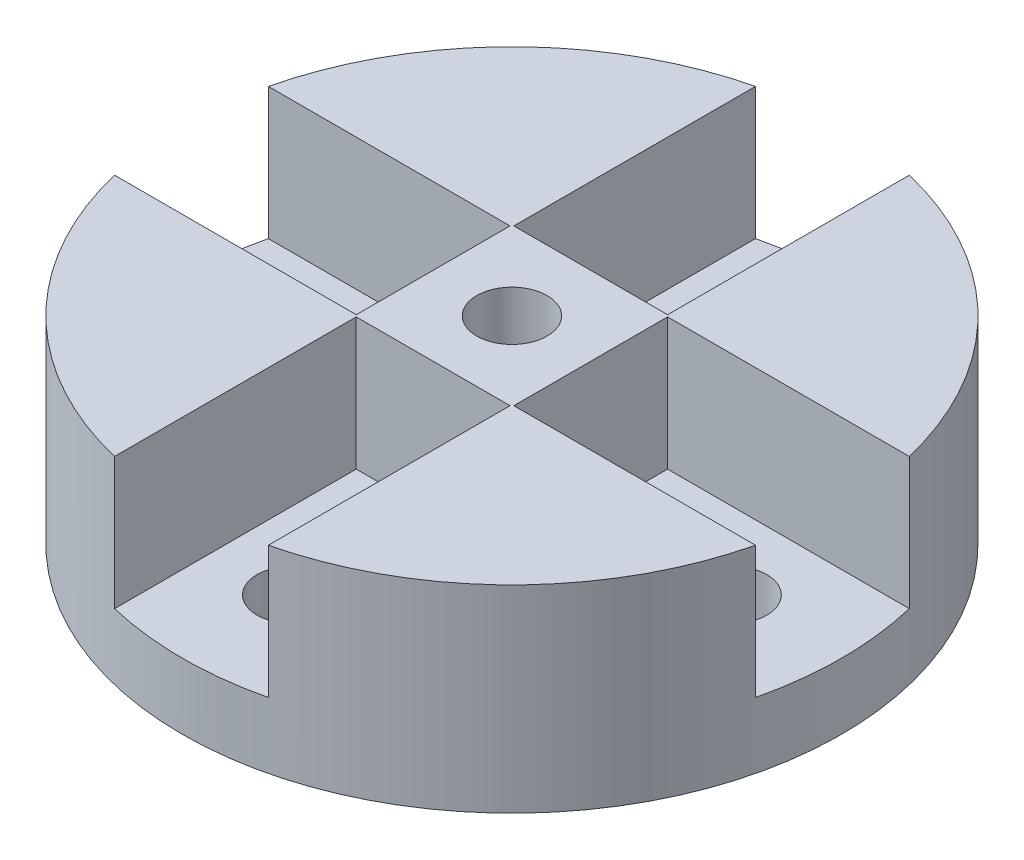
ISO-10303-21;
HEADER;
FILE_DESCRIPTION(('STEP AP214'),'2;1');
FILE_NAME('part.step','',(''),(''),'','','');
FILE_SCHEMA(('AUTOMOTIVE_DESIGN { 1 0 10303 214 1 1 1 1 }'));
ENDSEC;
DATA;
#1=APPLICATION_CONTEXT('core data for automotive mechanical design processes');
#2=APPLICATION_PROTOCOL_DEFINITION('international standard','automotive_design',2000,#1);
#3=PRODUCT_CONTEXT('',#1,'mechanical');
#4=PRODUCT('Part','Part','',(#3));
#5=PRODUCT_RELATED_PRODUCT_CATEGORY('part','',(#4));
#6=PRODUCT_DEFINITION_FORMATION('','',#4);
#7=PRODUCT_DEFINITION_CONTEXT('part definition',#1,'design');
#8=PRODUCT_DEFINITION('design','',#6,#7);
#9=PRODUCT_DEFINITION_SHAPE('','',#8);
#10=(LENGTH_UNIT() NAMED_UNIT(*) SI_UNIT(.MILLI.,.METRE.));
#11=(NAMED_UNIT(*) PLANE_ANGLE_UNIT() SI_UNIT($,.RADIAN.));
#12=(NAMED_UNIT(*) SI_UNIT($,.STERADIAN.) SOLID_ANGLE_UNIT());
#13=UNCERTAINTY_MEASURE_WITH_UNIT(LENGTH_MEASURE(1.E-05),#10,'distance_accuracy_value','');
#14=(GEOMETRIC_REPRESENTATION_CONTEXT(3) GLOBAL_UNCERTAINTY_ASSIGNED_CONTEXT((#13)) GLOBAL_UNIT_ASSIGNED_CONTEXT((#10,
#11,#12)) REPRESENTATION_CONTEXT('',''));
#15=CARTESIAN_POINT('',(0.,0.,0.));
#16=DIRECTION('',(0.,0.,1.));
#17=DIRECTION('',(1.,0.,0.));
#18=AXIS2_PLACEMENT_3D('',#15,#16,#17);
#19=CARTESIAN_POINT('',(0.,3.,0.));
#20=DIRECTION('',(0.,1.,0.));
#21=DIRECTION('',(0.,0.,1.));
#22=AXIS2_PLACEMENT_3D('',#19,#20,#21);
#23=PLANE('',#22);
#24=CARTESIAN_POINT('',(5.6598501634576E-13,3.,10.));
#25=DIRECTION('',(0.,1.,0.));
#26=DIRECTION('',(0.,0.,1.));
#27=AXIS2_PLACEMENT_3D('',#24,#25,#26);
#28=CIRCLE('',#27,1.60000000000061);
#29=CARTESIAN_POINT('',(5.6598501634576E-13,3.,11.6000000000006));
#30=VERTEX_POINT('',#29);
#31=EDGE_CURVE('E229',#30,#30,#28,.T.);
#32=ORIENTED_EDGE('',*,*,#31,.F.);
#33=EDGE_LOOP('',(#32));
#34=FACE_BOUND('',#33,.T.);
#35=CARTESIAN_POINT('',(0.,3.,0.));
#36=DIRECTION('',(0.,1.,0.));
#37=DIRECTION('',(0.,0.,1.));
#38=AXIS2_PLACEMENT_3D('',#35,#36,#37);
#39=CIRCLE('',#38,15.);
#40=CARTESIAN_POINT('',(-3.4999999999999,3.,14.5859521458148));
#41=VERTEX_POINT('',#40);
#42=CARTESIAN_POINT('',(3.5000000000001,3.,14.5859521458148));
#43=VERTEX_POINT('',#42);
#44=EDGE_CURVE('E252',#41,#43,#39,.T.);
#45=ORIENTED_EDGE('',*,*,#44,.T.);
#46=DIRECTION('',(0.,0.,-1.));
#47=VECTOR('',#46,1.);
#48=CARTESIAN_POINT('',(3.5,3.,0.));
#49=LINE('',#48,#47);
#50=CARTESIAN_POINT('',(3.50000000000002,3.,3.5859521458148));
#51=VERTEX_POINT('',#50);
#52=EDGE_CURVE('E52',#43,#51,#49,.T.);
#53=ORIENTED_EDGE('',*,*,#52,.T.);
#54=DIRECTION('',(-1.,0.,0.));
#55=VECTOR('',#54,1.);
#56=CARTESIAN_POINT('',(0.,3.,3.58595214581482));
#57=LINE('',#56,#55);
#58=CARTESIAN_POINT('',(-3.49999999999997,3.,3.58595214581485));
#59=VERTEX_POINT('',#58);
#60=EDGE_CURVE('E57',#51,#59,#57,.T.);
#61=ORIENTED_EDGE('',*,*,#60,.T.);
#62=DIRECTION('',(0.,0.,-1.));
#63=VECTOR('',#62,1.);
#64=CARTESIAN_POINT('',(-3.5,3.,0.));
#65=LINE('',#64,#63);
#66=EDGE_CURVE('E197',#41,#59,#65,.T.);
#67=ORIENTED_EDGE('',*,*,#66,.F.);
#68=EDGE_LOOP('',(#45,#53,#61,#67));
#69=FACE_BOUND('',#68,.T.);
#70=ADVANCED_FACE('F34',(#34,#69),#23,.T.);
#71=CARTESIAN_POINT('',(-9.99999999999972,3.,2.84217154972027E-13));
#72=DIRECTION('',(0.,1.,0.));
#73=DIRECTION('',(0.,0.,1.));
#74=AXIS2_PLACEMENT_3D('',#71,#72,#73);
#75=CIRCLE('',#74,1.60000000000046);
#76=CARTESIAN_POINT('',(-9.99999999999972,3.,1.60000000000074));
#77=VERTEX_POINT('',#76);
#78=EDGE_CURVE('E180',#77,#77,#75,.T.);
#79=ORIENTED_EDGE('',*,*,#78,.F.);
#80=EDGE_LOOP('',(#79));
#81=FACE_BOUND('',#80,.T.);
#82=CARTESIAN_POINT('',(-14.5859521458148,3.,-3.49999999999995));
#83=VERTEX_POINT('',#82);
#84=CARTESIAN_POINT('',(-14.5859521458148,3.,3.50000000000005));
#85=VERTEX_POINT('',#84);
#86=EDGE_CURVE('E260',#83,#85,#39,.T.);
#87=ORIENTED_EDGE('',*,*,#86,.T.);
#88=DIRECTION('',(1.,0.,0.));
#89=VECTOR('',#88,1.);
#90=CARTESIAN_POINT('',(0.,3.,3.5));
#91=LINE('',#90,#89);
#92=CARTESIAN_POINT('',(-3.58595214581481,3.,3.50000000000001));
#93=VERTEX_POINT('',#92);
#94=EDGE_CURVE('E274',#85,#93,#91,.T.);
#95=ORIENTED_EDGE('',*,*,#94,.T.);
#96=DIRECTION('',(0.,0.,-1.));
#97=VECTOR('',#96,1.);
#98=CARTESIAN_POINT('',(-3.58595214581482,3.,0.));
#99=LINE('',#98,#97);
#100=CARTESIAN_POINT('',(-3.58595214581483,3.,-3.49999999999999));
#101=VERTEX_POINT('',#100);
#102=EDGE_CURVE('E276',#93,#101,#99,.T.);
#103=ORIENTED_EDGE('',*,*,#102,.T.);
#104=DIRECTION('',(1.,0.,0.));
#105=VECTOR('',#104,1.);
#106=CARTESIAN_POINT('',(0.,3.,-3.5));
#107=LINE('',#106,#105);
#108=EDGE_CURVE('E279',#83,#101,#107,.T.);
#109=ORIENTED_EDGE('',*,*,#108,.F.);
#110=EDGE_LOOP('',(#87,#95,#103,#109));
#111=FACE_BOUND('',#110,.T.);
#112=ADVANCED_FACE('F366',(#81,#111),#23,.T.);
#113=CARTESIAN_POINT('',(0.,3.,-10.));
#114=DIRECTION('',(0.,1.,0.));
#115=DIRECTION('',(0.,0.,1.));
#116=AXIS2_PLACEMENT_3D('',#113,#114,#115);
#117=CIRCLE('',#116,1.6);
#118=CARTESIAN_POINT('',(0.,3.,-8.4));
#119=VERTEX_POINT('',#118);
#120=EDGE_CURVE('E241',#119,#119,#117,.T.);
#121=ORIENTED_EDGE('',*,*,#120,.F.);
#122=EDGE_LOOP('',(#121));
#123=FACE_BOUND('',#122,.T.);
#124=CARTESIAN_POINT('',(3.5,3.,-14.5859521458148));
#125=VERTEX_POINT('',#124);
#126=CARTESIAN_POINT('',(-3.5,3.,-14.5859521458148));
#127=VERTEX_POINT('',#126);
#128=EDGE_CURVE('E44',#125,#127,#39,.T.);
#129=ORIENTED_EDGE('',*,*,#128,.T.);
#130=DIRECTION('',(0.,0.,1.));
#131=VECTOR('',#130,1.);
#132=CARTESIAN_POINT('',(-3.5,3.,0.));
#133=LINE('',#132,#131);
#134=CARTESIAN_POINT('',(-3.5,3.,-3.58595214581482));
#135=VERTEX_POINT('',#134);
#136=EDGE_CURVE('E292',#127,#135,#133,.T.);
#137=ORIENTED_EDGE('',*,*,#136,.T.);
#138=DIRECTION('',(1.,0.,0.));
#139=VECTOR('',#138,1.);
#140=CARTESIAN_POINT('',(0.,3.,-3.58595214581482));
#141=LINE('',#140,#139);
#142=CARTESIAN_POINT('',(3.5,3.,-3.58595214581482));
#143=VERTEX_POINT('',#142);
#144=EDGE_CURVE('E290',#135,#143,#141,.T.);
#145=ORIENTED_EDGE('',*,*,#144,.T.);
#146=DIRECTION('',(0.,0.,1.));
#147=VECTOR('',#146,1.);
#148=CARTESIAN_POINT('',(3.5,3.,0.));
#149=LINE('',#148,#147);
#150=EDGE_CURVE('E297',#125,#143,#149,.T.);
#151=ORIENTED_EDGE('',*,*,#150,.F.);
#152=EDGE_LOOP('',(#129,#137,#145,#151));
#153=FACE_BOUND('',#152,.T.);
#154=ADVANCED_FACE('F372',(#123,#153),#23,.T.);
#155=CARTESIAN_POINT('',(10.0000000000003,3.,-2.8299250817288E-13));
#156=DIRECTION('',(0.,1.,0.));
#157=DIRECTION('',(0.,0.,1.));
#158=AXIS2_PLACEMENT_3D('',#155,#156,#157);
#159=CIRCLE('',#158,1.60000000000022);
#160=CARTESIAN_POINT('',(10.0000000000003,3.,1.59999999999994));
#161=VERTEX_POINT('',#160);
#162=EDGE_CURVE('E235',#161,#161,#159,.T.);
#163=ORIENTED_EDGE('',*,*,#162,.F.);
#164=EDGE_LOOP('',(#163));
#165=FACE_BOUND('',#164,.T.);
#166=CARTESIAN_POINT('',(14.5859521458149,3.,3.49999999999985));
#167=VERTEX_POINT('',#166);
#168=CARTESIAN_POINT('',(14.5859521458148,3.,-3.50000000000015));
#169=VERTEX_POINT('',#168);
#170=EDGE_CURVE('E11',#167,#169,#39,.T.);
#171=ORIENTED_EDGE('',*,*,#170,.T.);
#172=DIRECTION('',(-1.,0.,0.));
#173=VECTOR('',#172,1.);
#174=CARTESIAN_POINT('',(0.,3.,-3.5));
#175=LINE('',#174,#173);
#176=CARTESIAN_POINT('',(3.58595214581478,3.,-3.50000000000004));
#177=VERTEX_POINT('',#176);
#178=EDGE_CURVE('E38',#169,#177,#175,.T.);
#179=ORIENTED_EDGE('',*,*,#178,.T.);
#180=DIRECTION('',(0.,0.,1.));
#181=VECTOR('',#180,1.);
#182=CARTESIAN_POINT('',(3.58595214581482,3.,0.));
#183=LINE('',#182,#181);
#184=CARTESIAN_POINT('',(3.58595214581486,3.,3.49999999999996));
#185=VERTEX_POINT('',#184);
#186=EDGE_CURVE('E316',#177,#185,#183,.T.);
#187=ORIENTED_EDGE('',*,*,#186,.T.);
#188=DIRECTION('',(-1.,0.,0.));
#189=VECTOR('',#188,1.);
#190=CARTESIAN_POINT('',(0.,3.,3.5));
#191=LINE('',#190,#189);
#192=EDGE_CURVE('E317',#167,#185,#191,.T.);
#193=ORIENTED_EDGE('',*,*,#192,.F.);
#194=EDGE_LOOP('',(#171,#179,#187,#193));
#195=FACE_BOUND('',#194,.T.);
#196=ADVANCED_FACE('F368',(#165,#195),#23,.T.);
#197=CARTESIAN_POINT('',(0.,0.,0.));
#198=DIRECTION('',(0.,1.,0.));
#199=DIRECTION('',(0.,0.,1.));
#200=AXIS2_PLACEMENT_3D('',#197,#198,#199);
#201=PLANE('',#200);
#202=CARTESIAN_POINT('',(5.6598501634576E-13,0.,10.));
#203=DIRECTION('',(0.,1.,0.));
#204=DIRECTION('',(0.,0.,1.));
#205=AXIS2_PLACEMENT_3D('',#202,#203,#204);
#206=CIRCLE('',#205,1.60000000000061);
#207=CARTESIAN_POINT('',(5.6598501634576E-13,0.,11.6000000000006));
#208=VERTEX_POINT('',#207);
#209=EDGE_CURVE('E227',#208,#208,#206,.T.);
#210=ORIENTED_EDGE('',*,*,#209,.T.);
#211=EDGE_LOOP('',(#210));
#212=FACE_BOUND('',#211,.T.);
#213=CARTESIAN_POINT('',(0.,0.,-10.));
#214=DIRECTION('',(0.,1.,0.));
#215=DIRECTION('',(0.,0.,1.));
#216=AXIS2_PLACEMENT_3D('',#213,#214,#215);
#217=CIRCLE('',#216,1.6);
#218=CARTESIAN_POINT('',(0.,0.,-8.4));
#219=VERTEX_POINT('',#218);
#220=EDGE_CURVE('E238',#219,#219,#217,.T.);
#221=ORIENTED_EDGE('',*,*,#220,.T.);
#222=EDGE_LOOP('',(#221));
#223=FACE_BOUND('',#222,.T.);
#224=CARTESIAN_POINT('',(0.,0.,0.));
#225=DIRECTION('',(0.,1.,0.));
#226=DIRECTION('',(0.,0.,1.));
#227=AXIS2_PLACEMENT_3D('',#224,#225,#226);
#228=CIRCLE('',#227,15.);
#229=CARTESIAN_POINT('',(0.,0.,15.));
#230=VERTEX_POINT('',#229);
#231=EDGE_CURVE('E249',#230,#230,#228,.T.);
#232=ORIENTED_EDGE('',*,*,#231,.F.);
#233=EDGE_LOOP('',(#232));
#234=FACE_BOUND('',#233,.T.);
#235=CARTESIAN_POINT('',(0.,0.,0.));
#236=DIRECTION('',(0.,1.,0.));
#237=DIRECTION('',(0.,0.,1.));
#238=AXIS2_PLACEMENT_3D('',#235,#236,#237);
#239=CIRCLE('',#238,1.6);
#240=CARTESIAN_POINT('',(0.,0.,1.6));
#241=VERTEX_POINT('',#240);
#242=EDGE_CURVE('E244',#241,#241,#239,.T.);
#243=ORIENTED_EDGE('',*,*,#242,.T.);
#244=EDGE_LOOP('',(#243));
#245=FACE_BOUND('',#244,.T.);
#246=CARTESIAN_POINT('',(10.0000000000003,0.,-2.8299250817288E-13));
#247=DIRECTION('',(0.,1.,0.));
#248=DIRECTION('',(0.,0.,1.));
#249=AXIS2_PLACEMENT_3D('',#246,#247,#248);
#250=CIRCLE('',#249,1.60000000000022);
#251=CARTESIAN_POINT('',(10.0000000000003,0.,1.59999999999994));
#252=VERTEX_POINT('',#251);
#253=EDGE_CURVE('E232',#252,#252,#250,.T.);
#254=ORIENTED_EDGE('',*,*,#253,.T.);
#255=EDGE_LOOP('',(#254));
#256=FACE_BOUND('',#255,.T.);
#257=CARTESIAN_POINT('',(-9.99999999999972,0.,2.84217154972027E-13));
#258=DIRECTION('',(0.,1.,0.));
#259=DIRECTION('',(0.,0.,1.));
#260=AXIS2_PLACEMENT_3D('',#257,#258,#259);
#261=CIRCLE('',#260,1.60000000000046);
#262=CARTESIAN_POINT('',(-9.99999999999972,0.,1.60000000000074));
#263=VERTEX_POINT('',#262);
#264=EDGE_CURVE('E177',#263,#263,#261,.T.);
#265=ORIENTED_EDGE('',*,*,#264,.T.);
#266=EDGE_LOOP('',(#265));
#267=FACE_BOUND('',#266,.T.);
#268=ADVANCED_FACE('F362',(#212,#223,#234,#245,#256,#267),#201,.F.);
#269=CARTESIAN_POINT('',(0.,3.,0.));
#270=DIRECTION('',(0.,-1.,0.));
#271=DIRECTION('',(0.,0.,-1.));
#272=AXIS2_PLACEMENT_3D('',#269,#270,#271);
#273=CYLINDRICAL_SURFACE('',#272,15.);
#274=ORIENTED_EDGE('',*,*,#170,.F.);
#275=DIRECTION('',(0.,-1.,0.));
#276=VECTOR('',#275,1.);
#277=CARTESIAN_POINT('',(14.5859521458149,9.,3.49999999999985));
#278=LINE('',#277,#276);
#279=CARTESIAN_POINT('',(14.5859521458149,9.,3.49999999999985));
#280=VERTEX_POINT('',#279);
#281=EDGE_CURVE('E153',#280,#167,#278,.T.);
#282=ORIENTED_EDGE('',*,*,#281,.F.);
#283=CARTESIAN_POINT('',(0.,9.,0.));
#284=DIRECTION('',(0.,1.,0.));
#285=DIRECTION('',(0.,0.,1.));
#286=AXIS2_PLACEMENT_3D('',#283,#284,#285);
#287=CIRCLE('',#286,15.);
#288=CARTESIAN_POINT('',(3.5000000000001,9.,14.5859521458148));
#289=VERTEX_POINT('',#288);
#290=EDGE_CURVE('E160',#289,#280,#287,.T.);
#291=ORIENTED_EDGE('',*,*,#290,.F.);
#292=DIRECTION('',(0.,-1.,0.));
#293=VECTOR('',#292,1.);
#294=CARTESIAN_POINT('',(3.5000000000001,9.,14.5859521458148));
#295=LINE('',#294,#293);
#296=EDGE_CURVE('E190',#289,#43,#295,.T.);
#297=ORIENTED_EDGE('',*,*,#296,.T.);
#298=ORIENTED_EDGE('',*,*,#44,.F.);
#299=DIRECTION('',(0.,-1.,0.));
#300=VECTOR('',#299,1.);
#301=CARTESIAN_POINT('',(-3.4999999999999,9.,14.5859521458148));
#302=LINE('',#301,#300);
#303=CARTESIAN_POINT('',(-3.4999999999999,9.,14.5859521458148));
#304=VERTEX_POINT('',#303);
#305=EDGE_CURVE('E206',#304,#41,#302,.T.);
#306=ORIENTED_EDGE('',*,*,#305,.F.);
#307=CARTESIAN_POINT('',(-14.5859521458148,9.,3.50000000000005));
#308=VERTEX_POINT('',#307);
#309=EDGE_CURVE('E172',#308,#304,#287,.T.);
#310=ORIENTED_EDGE('',*,*,#309,.F.);
#311=DIRECTION('',(0.,-1.,0.));
#312=VECTOR('',#311,1.);
#313=CARTESIAN_POINT('',(-14.5859521458148,9.,3.50000000000005));
#314=LINE('',#313,#312);
#315=EDGE_CURVE('E211',#308,#85,#314,.T.);
#316=ORIENTED_EDGE('',*,*,#315,.T.);
#317=ORIENTED_EDGE('',*,*,#86,.F.);
#318=DIRECTION('',(0.,-1.,0.));
#319=VECTOR('',#318,1.);
#320=CARTESIAN_POINT('',(-14.5859521458148,9.,-3.49999999999995));
#321=LINE('',#320,#319);
#322=CARTESIAN_POINT('',(-14.5859521458148,9.,-3.49999999999995));
#323=VERTEX_POINT('',#322);
#324=EDGE_CURVE('E214',#323,#83,#321,.T.);
#325=ORIENTED_EDGE('',*,*,#324,.F.);
#326=CARTESIAN_POINT('',(-3.49999999999999,9.,-14.5859521458148));
#327=VERTEX_POINT('',#326);
#328=EDGE_CURVE('E334',#327,#323,#287,.T.);
#329=ORIENTED_EDGE('',*,*,#328,.F.);
#330=DIRECTION('',(0.,-1.,0.));
#331=VECTOR('',#330,1.);
#332=CARTESIAN_POINT('',(-3.49999999999999,9.,-14.5859521458148));
#333=LINE('',#332,#331);
#334=EDGE_CURVE('E219',#327,#127,#333,.T.);
#335=ORIENTED_EDGE('',*,*,#334,.T.);
#336=ORIENTED_EDGE('',*,*,#128,.F.);
#337=DIRECTION('',(0.,-1.,0.));
#338=VECTOR('',#337,1.);
#339=CARTESIAN_POINT('',(3.49999999999999,9.,-14.5859521458148));
#340=LINE('',#339,#338);
#341=CARTESIAN_POINT('',(3.49999999999999,9.,-14.5859521458148));
#342=VERTEX_POINT('',#341);
#343=EDGE_CURVE('E222',#342,#125,#340,.T.);
#344=ORIENTED_EDGE('',*,*,#343,.F.);
#345=CARTESIAN_POINT('',(14.5859521458148,9.,-3.50000000000015));
#346=VERTEX_POINT('',#345);
#347=EDGE_CURVE('E173',#346,#342,#287,.T.);
#348=ORIENTED_EDGE('',*,*,#347,.F.);
#349=DIRECTION('',(0.,-1.,0.));
#350=VECTOR('',#349,1.);
#351=CARTESIAN_POINT('',(14.5859521458148,9.,-3.50000000000015));
#352=LINE('',#351,#350);
#353=EDGE_CURVE('E224',#346,#169,#352,.T.);
#354=ORIENTED_EDGE('',*,*,#353,.T.);
#355=EDGE_LOOP('',(#274,#282,#291,#297,#298,#306,#310,#316,#317,#325,#329,#335,#336,#344,#348,#354));
#356=FACE_BOUND('',#355,.T.);
#357=ORIENTED_EDGE('',*,*,#231,.T.);
#358=EDGE_LOOP('',(#357));
#359=FACE_BOUND('',#358,.T.);
#360=ADVANCED_FACE('F36',(#356,#359),#273,.T.);
#361=CARTESIAN_POINT('',(0.,3.,0.));
#362=DIRECTION('',(0.,-1.,0.));
#363=DIRECTION('',(0.,0.,-1.));
#364=AXIS2_PLACEMENT_3D('',#361,#362,#363);
#365=CYLINDRICAL_SURFACE('',#364,1.6);
#366=ORIENTED_EDGE('',*,*,#242,.F.);
#367=EDGE_LOOP('',(#366));
#368=FACE_BOUND('',#367,.T.);
#369=CARTESIAN_POINT('',(0.,9.,0.));
#370=DIRECTION('',(0.,1.,0.));
#371=DIRECTION('',(0.,0.,1.));
#372=AXIS2_PLACEMENT_3D('',#369,#370,#371);
#373=CIRCLE('',#372,1.6);
#374=CARTESIAN_POINT('',(0.,9.,1.6));
#375=VERTEX_POINT('',#374);
#376=EDGE_CURVE('E170',#375,#375,#373,.F.);
#377=ORIENTED_EDGE('',*,*,#376,.F.);
#378=EDGE_LOOP('',(#377));
#379=FACE_BOUND('',#378,.T.);
#380=ADVANCED_FACE('F350',(#368,#379),#365,.F.);
#381=CARTESIAN_POINT('',(0.,3.,-10.));
#382=DIRECTION('',(0.,-1.,0.));
#383=DIRECTION('',(0.,0.,-1.));
#384=AXIS2_PLACEMENT_3D('',#381,#382,#383);
#385=CYLINDRICAL_SURFACE('',#384,1.6);
#386=ORIENTED_EDGE('',*,*,#120,.T.);
#387=EDGE_LOOP('',(#386));
#388=FACE_BOUND('',#387,.T.);
#389=ORIENTED_EDGE('',*,*,#220,.F.);
#390=EDGE_LOOP('',(#389));
#391=FACE_BOUND('',#390,.T.);
#392=ADVANCED_FACE('F352',(#388,#391),#385,.F.);
#393=CARTESIAN_POINT('',(10.0000000000003,3.,-2.8299250817288E-13));
#394=DIRECTION('',(0.,-1.,0.));
#395=DIRECTION('',(0.,0.,-1.));
#396=AXIS2_PLACEMENT_3D('',#393,#394,#395);
#397=CYLINDRICAL_SURFACE('',#396,1.60000000000022);
#398=ORIENTED_EDGE('',*,*,#162,.T.);
#399=EDGE_LOOP('',(#398));
#400=FACE_BOUND('',#399,.T.);
#401=ORIENTED_EDGE('',*,*,#253,.F.);
#402=EDGE_LOOP('',(#401));
#403=FACE_BOUND('',#402,.T.);
#404=ADVANCED_FACE('F359',(#400,#403),#397,.F.);
#405=CARTESIAN_POINT('',(5.6598501634576E-13,3.,10.));
#406=DIRECTION('',(0.,-1.,0.));
#407=DIRECTION('',(0.,0.,-1.));
#408=AXIS2_PLACEMENT_3D('',#405,#406,#407);
#409=CYLINDRICAL_SURFACE('',#408,1.60000000000061);
#410=ORIENTED_EDGE('',*,*,#31,.T.);
#411=EDGE_LOOP('',(#410));
#412=FACE_BOUND('',#411,.T.);
#413=ORIENTED_EDGE('',*,*,#209,.F.);
#414=EDGE_LOOP('',(#413));
#415=FACE_BOUND('',#414,.T.);
#416=ADVANCED_FACE('F387',(#412,#415),#409,.F.);
#417=CARTESIAN_POINT('',(-9.99999999999972,3.,2.84217154972027E-13));
#418=DIRECTION('',(0.,-1.,0.));
#419=DIRECTION('',(0.,0.,-1.));
#420=AXIS2_PLACEMENT_3D('',#417,#418,#419);
#421=CYLINDRICAL_SURFACE('',#420,1.60000000000046);
#422=ORIENTED_EDGE('',*,*,#78,.T.);
#423=EDGE_LOOP('',(#422));
#424=FACE_BOUND('',#423,.T.);
#425=ORIENTED_EDGE('',*,*,#264,.F.);
#426=EDGE_LOOP('',(#425));
#427=FACE_BOUND('',#426,.T.);
#428=ADVANCED_FACE('F394',(#424,#427),#421,.F.);
#429=CARTESIAN_POINT('',(0.,9.,3.5));
#430=DIRECTION('',(0.,0.,1.));
#431=DIRECTION('',(1.,0.,0.));
#432=AXIS2_PLACEMENT_3D('',#429,#430,#431);
#433=PLANE('',#432);
#434=ORIENTED_EDGE('',*,*,#192,.T.);
#435=DIRECTION('',(0.,-1.,0.));
#436=VECTOR('',#435,1.);
#437=CARTESIAN_POINT('',(3.58595214581486,9.,3.49999999999996));
#438=LINE('',#437,#436);
#439=CARTESIAN_POINT('',(3.58595214581486,9.,3.49999999999996));
#440=VERTEX_POINT('',#439);
#441=EDGE_CURVE('E155',#440,#185,#438,.T.);
#442=ORIENTED_EDGE('',*,*,#441,.F.);
#443=DIRECTION('',(-1.,0.,0.));
#444=VECTOR('',#443,1.);
#445=CARTESIAN_POINT('',(0.,9.,3.5));
#446=LINE('',#445,#444);
#447=EDGE_CURVE('E148',#280,#440,#446,.T.);
#448=ORIENTED_EDGE('',*,*,#447,.F.);
#449=ORIENTED_EDGE('',*,*,#281,.T.);
#450=EDGE_LOOP('',(#434,#442,#448,#449));
#451=FACE_BOUND('',#450,.T.);
#452=ADVANCED_FACE('F151',(#451),#433,.F.);
#453=CARTESIAN_POINT('',(3.58595214581482,9.,0.));
#454=DIRECTION('',(1.,0.,0.));
#455=DIRECTION('',(0.,0.,-1.));
#456=AXIS2_PLACEMENT_3D('',#453,#454,#455);
#457=PLANE('',#456);
#458=ORIENTED_EDGE('',*,*,#186,.F.);
#459=DIRECTION('',(0.,-1.,0.));
#460=VECTOR('',#459,1.);
#461=CARTESIAN_POINT('',(3.58595214581478,9.,-3.50000000000004));
#462=LINE('',#461,#460);
#463=CARTESIAN_POINT('',(3.58595214581478,9.,-3.50000000000004));
#464=VERTEX_POINT('',#463);
#465=EDGE_CURVE('E182',#464,#177,#462,.T.);
#466=ORIENTED_EDGE('',*,*,#465,.F.);
#467=DIRECTION('',(0.,0.,1.));
#468=VECTOR('',#467,1.);
#469=CARTESIAN_POINT('',(3.58595214581482,9.,0.));
#470=LINE('',#469,#468);
#471=EDGE_CURVE('E159',#464,#440,#470,.T.);
#472=ORIENTED_EDGE('',*,*,#471,.T.);
#473=ORIENTED_EDGE('',*,*,#441,.T.);
#474=EDGE_LOOP('',(#458,#466,#472,#473));
#475=FACE_BOUND('',#474,.T.);
#476=ADVANCED_FACE('F402',(#475),#457,.T.);
#477=CARTESIAN_POINT('',(0.,9.,-3.5));
#478=DIRECTION('',(0.,0.,1.));
#479=DIRECTION('',(1.,0.,0.));
#480=AXIS2_PLACEMENT_3D('',#477,#478,#479);
#481=PLANE('',#480);
#482=ORIENTED_EDGE('',*,*,#178,.F.);
#483=ORIENTED_EDGE('',*,*,#353,.F.);
#484=DIRECTION('',(-1.,0.,0.));
#485=VECTOR('',#484,1.);
#486=CARTESIAN_POINT('',(0.,9.,-3.5));
#487=LINE('',#486,#485);
#488=EDGE_CURVE('E343',#346,#464,#487,.T.);
#489=ORIENTED_EDGE('',*,*,#488,.T.);
#490=ORIENTED_EDGE('',*,*,#465,.T.);
#491=EDGE_LOOP('',(#482,#483,#489,#490));
#492=FACE_BOUND('',#491,.T.);
#493=ADVANCED_FACE('F313',(#492),#481,.T.);
#494=CARTESIAN_POINT('',(3.5,9.,0.));
#495=DIRECTION('',(1.,0.,0.));
#496=DIRECTION('',(0.,0.,-1.));
#497=AXIS2_PLACEMENT_3D('',#494,#495,#496);
#498=PLANE('',#497);
#499=ORIENTED_EDGE('',*,*,#150,.T.);
#500=DIRECTION('',(0.,-1.,0.));
#501=VECTOR('',#500,1.);
#502=CARTESIAN_POINT('',(3.5,9.,-3.58595214581482));
#503=LINE('',#502,#501);
#504=CARTESIAN_POINT('',(3.5,9.,-3.58595214581482));
#505=VERTEX_POINT('',#504);
#506=EDGE_CURVE('E218',#505,#143,#503,.T.);
#507=ORIENTED_EDGE('',*,*,#506,.F.);
#508=DIRECTION('',(0.,0.,1.));
#509=VECTOR('',#508,1.);
#510=CARTESIAN_POINT('',(3.5,9.,0.));
#511=LINE('',#510,#509);
#512=EDGE_CURVE('E341',#342,#505,#511,.T.);
#513=ORIENTED_EDGE('',*,*,#512,.F.);
#514=ORIENTED_EDGE('',*,*,#343,.T.);
#515=EDGE_LOOP('',(#499,#507,#513,#514));
#516=FACE_BOUND('',#515,.T.);
#517=ADVANCED_FACE('F412',(#516),#498,.F.);
#518=CARTESIAN_POINT('',(0.,9.,-3.58595214581482));
#519=DIRECTION('',(0.,0.,-1.));
#520=DIRECTION('',(-1.,0.,0.));
#521=AXIS2_PLACEMENT_3D('',#518,#519,#520);
#522=PLANE('',#521);
#523=ORIENTED_EDGE('',*,*,#144,.F.);
#524=DIRECTION('',(0.,-1.,0.));
#525=VECTOR('',#524,1.);
#526=CARTESIAN_POINT('',(-3.5,9.,-3.58595214581482));
#527=LINE('',#526,#525);
#528=CARTESIAN_POINT('',(-3.5,9.,-3.58595214581482));
#529=VERTEX_POINT('',#528);
#530=EDGE_CURVE('E215',#529,#135,#527,.T.);
#531=ORIENTED_EDGE('',*,*,#530,.F.);
#532=DIRECTION('',(1.,0.,0.));
#533=VECTOR('',#532,1.);
#534=CARTESIAN_POINT('',(0.,9.,-3.58595214581482));
#535=LINE('',#534,#533);
#536=EDGE_CURVE('E338',#529,#505,#535,.T.);
#537=ORIENTED_EDGE('',*,*,#536,.T.);
#538=ORIENTED_EDGE('',*,*,#506,.T.);
#539=EDGE_LOOP('',(#523,#531,#537,#538));
#540=FACE_BOUND('',#539,.T.);
#541=ADVANCED_FACE('F415',(#540),#522,.T.);
#542=CARTESIAN_POINT('',(-3.5,9.,0.));
#543=DIRECTION('',(1.,0.,0.));
#544=DIRECTION('',(0.,0.,-1.));
#545=AXIS2_PLACEMENT_3D('',#542,#543,#544);
#546=PLANE('',#545);
#547=ORIENTED_EDGE('',*,*,#136,.F.);
#548=ORIENTED_EDGE('',*,*,#334,.F.);
#549=DIRECTION('',(0.,0.,1.));
#550=VECTOR('',#549,1.);
#551=CARTESIAN_POINT('',(-3.5,9.,0.));
#552=LINE('',#551,#550);
#553=EDGE_CURVE('E335',#327,#529,#552,.T.);
#554=ORIENTED_EDGE('',*,*,#553,.T.);
#555=ORIENTED_EDGE('',*,*,#530,.T.);
#556=EDGE_LOOP('',(#547,#548,#554,#555));
#557=FACE_BOUND('',#556,.T.);
#558=ADVANCED_FACE('F419',(#557),#546,.T.);
#559=CARTESIAN_POINT('',(0.,9.,-3.5));
#560=DIRECTION('',(0.,0.,-1.));
#561=DIRECTION('',(-1.,0.,0.));
#562=AXIS2_PLACEMENT_3D('',#559,#560,#561);
#563=PLANE('',#562);
#564=ORIENTED_EDGE('',*,*,#108,.T.);
#565=DIRECTION('',(0.,-1.,0.));
#566=VECTOR('',#565,1.);
#567=CARTESIAN_POINT('',(-3.58595214581483,9.,-3.49999999999999));
#568=LINE('',#567,#566);
#569=CARTESIAN_POINT('',(-3.58595214581483,9.,-3.49999999999999));
#570=VERTEX_POINT('',#569);
#571=EDGE_CURVE('E210',#570,#101,#568,.T.);
#572=ORIENTED_EDGE('',*,*,#571,.F.);
#573=DIRECTION('',(1.,0.,0.));
#574=VECTOR('',#573,1.);
#575=CARTESIAN_POINT('',(0.,9.,-3.5));
#576=LINE('',#575,#574);
#577=EDGE_CURVE('E332',#323,#570,#576,.T.);
#578=ORIENTED_EDGE('',*,*,#577,.F.);
#579=ORIENTED_EDGE('',*,*,#324,.T.);
#580=EDGE_LOOP('',(#564,#572,#578,#579));
#581=FACE_BOUND('',#580,.T.);
#582=ADVANCED_FACE('F423',(#581),#563,.F.);
#583=CARTESIAN_POINT('',(-3.58595214581482,9.,0.));
#584=DIRECTION('',(-1.,0.,0.));
#585=DIRECTION('',(0.,0.,1.));
#586=AXIS2_PLACEMENT_3D('',#583,#584,#585);
#587=PLANE('',#586);
#588=ORIENTED_EDGE('',*,*,#102,.F.);
#589=DIRECTION('',(0.,-1.,0.));
#590=VECTOR('',#589,1.);
#591=CARTESIAN_POINT('',(-3.58595214581481,9.,3.50000000000001));
#592=LINE('',#591,#590);
#593=CARTESIAN_POINT('',(-3.58595214581481,9.,3.50000000000001));
#594=VERTEX_POINT('',#593);
#595=EDGE_CURVE('E207',#594,#93,#592,.T.);
#596=ORIENTED_EDGE('',*,*,#595,.F.);
#597=DIRECTION('',(0.,0.,-1.));
#598=VECTOR('',#597,1.);
#599=CARTESIAN_POINT('',(-3.58595214581482,9.,0.));
#600=LINE('',#599,#598);
#601=EDGE_CURVE('E329',#594,#570,#600,.T.);
#602=ORIENTED_EDGE('',*,*,#601,.T.);
#603=ORIENTED_EDGE('',*,*,#571,.T.);
#604=EDGE_LOOP('',(#588,#596,#602,#603));
#605=FACE_BOUND('',#604,.T.);
#606=ADVANCED_FACE('F427',(#605),#587,.T.);
#607=CARTESIAN_POINT('',(0.,9.,3.5));
#608=DIRECTION('',(0.,0.,-1.));
#609=DIRECTION('',(-1.,0.,0.));
#610=AXIS2_PLACEMENT_3D('',#607,#608,#609);
#611=PLANE('',#610);
#612=ORIENTED_EDGE('',*,*,#94,.F.);
#613=ORIENTED_EDGE('',*,*,#315,.F.);
#614=DIRECTION('',(1.,0.,0.));
#615=VECTOR('',#614,1.);
#616=CARTESIAN_POINT('',(0.,9.,3.5));
#617=LINE('',#616,#615);
#618=EDGE_CURVE('E326',#308,#594,#617,.T.);
#619=ORIENTED_EDGE('',*,*,#618,.T.);
#620=ORIENTED_EDGE('',*,*,#595,.T.);
#621=EDGE_LOOP('',(#612,#613,#619,#620));
#622=FACE_BOUND('',#621,.T.);
#623=ADVANCED_FACE('F431',(#622),#611,.T.);
#624=CARTESIAN_POINT('',(-3.5,9.,0.));
#625=DIRECTION('',(-1.,0.,0.));
#626=DIRECTION('',(0.,0.,1.));
#627=AXIS2_PLACEMENT_3D('',#624,#625,#626);
#628=PLANE('',#627);
#629=ORIENTED_EDGE('',*,*,#66,.T.);
#630=DIRECTION('',(0.,-1.,0.));
#631=VECTOR('',#630,1.);
#632=CARTESIAN_POINT('',(-3.49999999999997,9.,3.58595214581485));
#633=LINE('',#632,#631);
#634=CARTESIAN_POINT('',(-3.49999999999997,9.,3.58595214581485));
#635=VERTEX_POINT('',#634);
#636=EDGE_CURVE('E204',#635,#59,#633,.T.);
#637=ORIENTED_EDGE('',*,*,#636,.F.);
#638=DIRECTION('',(0.,0.,-1.));
#639=VECTOR('',#638,1.);
#640=CARTESIAN_POINT('',(-3.5,9.,0.));
#641=LINE('',#640,#639);
#642=EDGE_CURVE('E324',#304,#635,#641,.T.);
#643=ORIENTED_EDGE('',*,*,#642,.F.);
#644=ORIENTED_EDGE('',*,*,#305,.T.);
#645=EDGE_LOOP('',(#629,#637,#643,#644));
#646=FACE_BOUND('',#645,.T.);
#647=ADVANCED_FACE('F435',(#646),#628,.F.);
#648=CARTESIAN_POINT('',(0.,9.,3.58595214581482));
#649=DIRECTION('',(0.,0.,1.));
#650=DIRECTION('',(1.,0.,0.));
#651=AXIS2_PLACEMENT_3D('',#648,#649,#650);
#652=PLANE('',#651);
#653=ORIENTED_EDGE('',*,*,#60,.F.);
#654=DIRECTION('',(0.,-1.,0.));
#655=VECTOR('',#654,1.);
#656=CARTESIAN_POINT('',(3.50000000000002,9.,3.5859521458148));
#657=LINE('',#656,#655);
#658=CARTESIAN_POINT('',(3.50000000000002,9.,3.5859521458148));
#659=VERTEX_POINT('',#658);
#660=EDGE_CURVE('E192',#659,#51,#657,.T.);
#661=ORIENTED_EDGE('',*,*,#660,.F.);
#662=DIRECTION('',(-1.,0.,0.));
#663=VECTOR('',#662,1.);
#664=CARTESIAN_POINT('',(0.,9.,3.58595214581482));
#665=LINE('',#664,#663);
#666=EDGE_CURVE('E322',#659,#635,#665,.T.);
#667=ORIENTED_EDGE('',*,*,#666,.T.);
#668=ORIENTED_EDGE('',*,*,#636,.T.);
#669=EDGE_LOOP('',(#653,#661,#667,#668));
#670=FACE_BOUND('',#669,.T.);
#671=ADVANCED_FACE('F272',(#670),#652,.T.);
#672=CARTESIAN_POINT('',(3.5,9.,0.));
#673=DIRECTION('',(-1.,0.,0.));
#674=DIRECTION('',(0.,0.,1.));
#675=AXIS2_PLACEMENT_3D('',#672,#673,#674);
#676=PLANE('',#675);
#677=ORIENTED_EDGE('',*,*,#52,.F.);
#678=ORIENTED_EDGE('',*,*,#296,.F.);
#679=DIRECTION('',(0.,0.,-1.));
#680=VECTOR('',#679,1.);
#681=CARTESIAN_POINT('',(3.5,9.,0.));
#682=LINE('',#681,#680);
#683=EDGE_CURVE('E167',#289,#659,#682,.T.);
#684=ORIENTED_EDGE('',*,*,#683,.T.);
#685=ORIENTED_EDGE('',*,*,#660,.T.);
#686=EDGE_LOOP('',(#677,#678,#684,#685));
#687=FACE_BOUND('',#686,.T.);
#688=ADVANCED_FACE('F269',(#687),#676,.T.);
#689=CARTESIAN_POINT('',(0.,9.,0.));
#690=DIRECTION('',(0.,1.,0.));
#691=DIRECTION('',(0.,0.,1.));
#692=AXIS2_PLACEMENT_3D('',#689,#690,#691);
#693=PLANE('',#692);
#694=ORIENTED_EDGE('',*,*,#376,.T.);
#695=EDGE_LOOP('',(#694));
#696=FACE_BOUND('',#695,.T.);
#697=ORIENTED_EDGE('',*,*,#290,.T.);
#698=ORIENTED_EDGE('',*,*,#447,.T.);
#699=ORIENTED_EDGE('',*,*,#471,.F.);
#700=ORIENTED_EDGE('',*,*,#488,.F.);
#701=ORIENTED_EDGE('',*,*,#347,.T.);
#702=ORIENTED_EDGE('',*,*,#512,.T.);
#703=ORIENTED_EDGE('',*,*,#536,.F.);
#704=ORIENTED_EDGE('',*,*,#553,.F.);
#705=ORIENTED_EDGE('',*,*,#328,.T.);
#706=ORIENTED_EDGE('',*,*,#577,.T.);
#707=ORIENTED_EDGE('',*,*,#601,.F.);
#708=ORIENTED_EDGE('',*,*,#618,.F.);
#709=ORIENTED_EDGE('',*,*,#309,.T.);
#710=ORIENTED_EDGE('',*,*,#642,.T.);
#711=ORIENTED_EDGE('',*,*,#666,.F.);
#712=ORIENTED_EDGE('',*,*,#683,.F.);
#713=EDGE_LOOP('',(#697,#698,#699,#700,#701,#702,#703,#704,#705,#706,#707,#708,#709,#710,#711,#712));
#714=FACE_BOUND('',#713,.T.);
#715=ADVANCED_FACE('F164',(#696,#714),#693,.T.);
#716=CLOSED_SHELL('',(#70,#112,#154,#196,#268,#360,#380,#392,#404,#416,#428,#452,#476,#493,#517,
#541,#558,#582,#606,#623,#647,#671,#688,#715));
#717=MANIFOLD_SOLID_BREP('B2',#716);
#718=ADVANCED_BREP_SHAPE_REPRESENTATION('',(#18,#717),#14);
#719=SHAPE_DEFINITION_REPRESENTATION(#9,#718);
ENDSEC;
END-ISO-10303-21;
